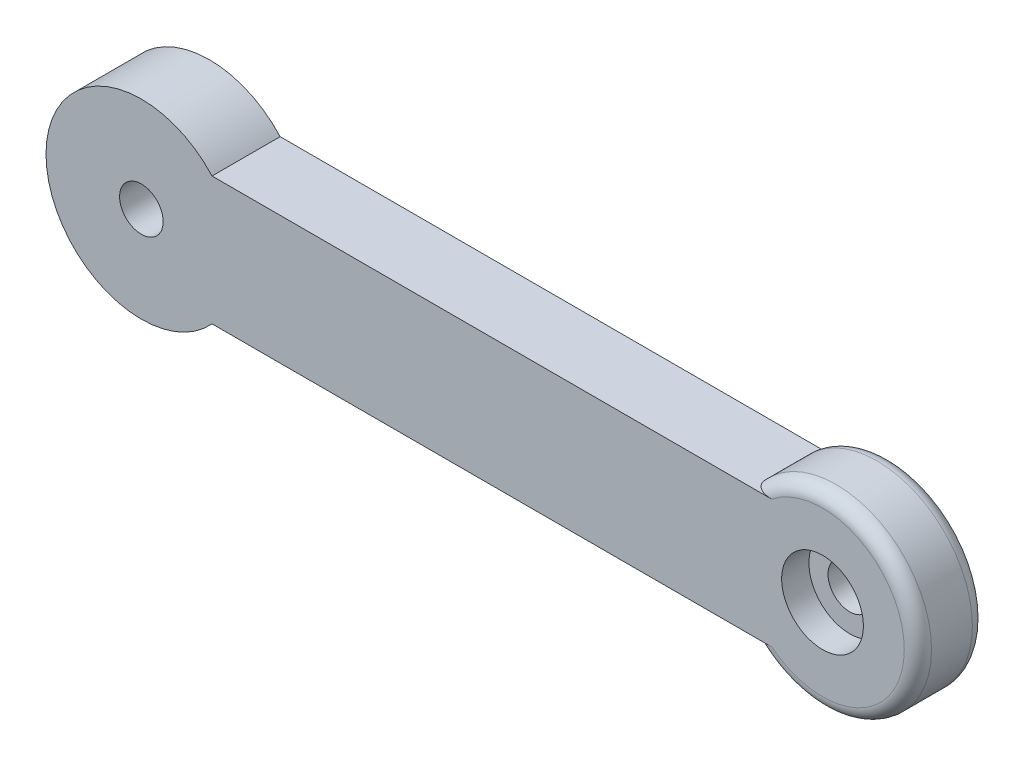
ISO-10303-21;
HEADER;
FILE_DESCRIPTION(('STEP AP214'),'2;1');
FILE_NAME('part.step','',(''),(''),'','','');
FILE_SCHEMA(('AUTOMOTIVE_DESIGN { 1 0 10303 214 1 1 1 1 }'));
ENDSEC;
DATA;
#1=APPLICATION_CONTEXT('core data for automotive mechanical design processes');
#2=APPLICATION_PROTOCOL_DEFINITION('international standard','automotive_design',2000,#1);
#3=PRODUCT_CONTEXT('',#1,'mechanical');
#4=PRODUCT('Part','Part','',(#3));
#5=PRODUCT_RELATED_PRODUCT_CATEGORY('part','',(#4));
#6=PRODUCT_DEFINITION_FORMATION('','',#4);
#7=PRODUCT_DEFINITION_CONTEXT('part definition',#1,'design');
#8=PRODUCT_DEFINITION('design','',#6,#7);
#9=PRODUCT_DEFINITION_SHAPE('','',#8);
#10=(LENGTH_UNIT() NAMED_UNIT(*) SI_UNIT(.MILLI.,.METRE.));
#11=(NAMED_UNIT(*) PLANE_ANGLE_UNIT() SI_UNIT($,.RADIAN.));
#12=(NAMED_UNIT(*) SI_UNIT($,.STERADIAN.) SOLID_ANGLE_UNIT());
#13=UNCERTAINTY_MEASURE_WITH_UNIT(LENGTH_MEASURE(1.E-05),#10,'distance_accuracy_value','');
#14=(GEOMETRIC_REPRESENTATION_CONTEXT(3) GLOBAL_UNCERTAINTY_ASSIGNED_CONTEXT((#13)) GLOBAL_UNIT_ASSIGNED_CONTEXT((#10,
#11,#12)) REPRESENTATION_CONTEXT('',''));
#15=CARTESIAN_POINT('',(0.,0.,0.));
#16=DIRECTION('',(0.,0.,1.));
#17=DIRECTION('',(1.,0.,0.));
#18=AXIS2_PLACEMENT_3D('',#15,#16,#17);
#19=CARTESIAN_POINT('',(50.,0.,5.));
#20=DIRECTION('',(0.,0.,-1.));
#21=DIRECTION('',(-1.,0.,0.));
#22=AXIS2_PLACEMENT_3D('',#19,#20,#21);
#23=CYLINDRICAL_SURFACE('',#22,1.6);
#24=CARTESIAN_POINT('',(50.,0.,0.));
#25=DIRECTION('',(0.,0.,1.));
#26=DIRECTION('',(1.,0.,0.));
#27=AXIS2_PLACEMENT_3D('',#24,#25,#26);
#28=CIRCLE('',#27,1.6);
#29=CARTESIAN_POINT('',(51.6,0.,0.));
#30=VERTEX_POINT('',#29);
#31=EDGE_CURVE('E136',#30,#30,#28,.T.);
#32=ORIENTED_EDGE('',*,*,#31,.F.);
#33=EDGE_LOOP('',(#32));
#34=FACE_BOUND('',#33,.T.);
#35=CARTESIAN_POINT('',(50.,0.,3.));
#36=DIRECTION('',(0.,0.,1.));
#37=DIRECTION('',(1.,0.,0.));
#38=AXIS2_PLACEMENT_3D('',#35,#36,#37);
#39=CIRCLE('',#38,1.6);
#40=CARTESIAN_POINT('',(51.6,0.,3.));
#41=VERTEX_POINT('',#40);
#42=EDGE_CURVE('E132',#41,#41,#39,.T.);
#43=ORIENTED_EDGE('',*,*,#42,.T.);
#44=EDGE_LOOP('',(#43));
#45=FACE_BOUND('',#44,.T.);
#46=ADVANCED_FACE('F37',(#34,#45),#23,.F.);
#47=CARTESIAN_POINT('',(0.,-4.7,5.));
#48=DIRECTION('',(0.,1.,0.));
#49=DIRECTION('',(0.,0.,1.));
#50=AXIS2_PLACEMENT_3D('',#47,#48,#49);
#51=PLANE('',#50);
#52=DIRECTION('',(1.,0.,0.));
#53=VECTOR('',#52,1.);
#54=CARTESIAN_POINT('',(0.,-4.7,5.));
#55=LINE('',#54,#53);
#56=CARTESIAN_POINT('',(5.18748493973718,-4.7,5.));
#57=VERTEX_POINT('',#56);
#58=CARTESIAN_POINT('',(46.2703887602057,-4.7,5.));
#59=VERTEX_POINT('',#58);
#60=EDGE_CURVE('E65',#57,#59,#55,.T.);
#61=ORIENTED_EDGE('',*,*,#60,.F.);
#62=DIRECTION('',(0.,0.,1.));
#63=VECTOR('',#62,1.);
#64=CARTESIAN_POINT('',(5.18748493973718,-4.7,0.));
#65=LINE('',#64,#63);
#66=CARTESIAN_POINT('',(5.18748493973718,-4.7,0.));
#67=VERTEX_POINT('',#66);
#68=EDGE_CURVE('E113',#57,#67,#65,.F.);
#69=ORIENTED_EDGE('',*,*,#68,.T.);
#70=DIRECTION('',(1.,0.,0.));
#71=VECTOR('',#70,1.);
#72=CARTESIAN_POINT('',(0.,-4.7,0.));
#73=LINE('',#72,#71);
#74=CARTESIAN_POINT('',(46.2703887602057,-4.7,0.));
#75=VERTEX_POINT('',#74);
#76=EDGE_CURVE('E104',#67,#75,#73,.T.);
#77=ORIENTED_EDGE('',*,*,#76,.T.);
#78=CARTESIAN_POINT('',(46.2703887602057,-4.7,0.));
#79=CARTESIAN_POINT('',(46.207775908054,-4.7,1.29160496456107E-05));
#80=CARTESIAN_POINT('',(46.145117563673,-4.7,0.00227437282465497));
#81=CARTESIAN_POINT('',(46.0199481893415,-4.7,0.0118273800545397));
#82=CARTESIAN_POINT('',(45.9574386747327,-4.7,0.0191384170084201));
#83=CARTESIAN_POINT('',(45.8324410994155,-4.7,0.0394710863082272));
#84=CARTESIAN_POINT('',(45.7699652687475,-4.7,0.0525702260540256));
#85=CARTESIAN_POINT('',(45.6467753973174,-4.7,0.0850983438826876));
#86=CARTESIAN_POINT('',(45.5860584334084,-4.7,0.104516075005994));
#87=CARTESIAN_POINT('',(45.4634272698965,-4.7,0.151848009624573));
#88=CARTESIAN_POINT('',(45.4016906517796,-4.7,0.180231436314618));
#89=CARTESIAN_POINT('',(45.2831858420289,-4.7,0.245628105858938));
#90=CARTESIAN_POINT('',(45.2263984340426,-4.7,0.282605720433216));
#91=CARTESIAN_POINT('',(45.1293399579975,-4.7,0.358446107781042));
#92=CARTESIAN_POINT('',(45.0879213757702,-4.7,0.395830324599347));
#93=CARTESIAN_POINT('',(45.0116713655026,-4.7,0.476880957830328));
#94=CARTESIAN_POINT('',(44.9768365048115,-4.7,0.520544079491267));
#95=CARTESIAN_POINT('',(44.9213213921304,-4.7,0.605177600143538));
#96=CARTESIAN_POINT('',(44.8992215804084,-4.7,0.645214921997107));
#97=CARTESIAN_POINT('',(44.8619994490983,-4.7,0.728383597377398));
#98=CARTESIAN_POINT('',(44.8468643031955,-4.7,0.771509092931161));
#99=CARTESIAN_POINT('',(44.8280442961094,-4.7,0.845694544044094));
#100=CARTESIAN_POINT('',(44.8222488202584,-4.7,0.876230734391645));
#101=CARTESIAN_POINT('',(44.8144721882695,-4.7,0.937835875568852));
#102=CARTESIAN_POINT('',(44.8124975383637,-4.7,0.968905644416676));
#103=CARTESIAN_POINT('',(44.8125150602628,-4.7,1.));
#104=B_SPLINE_CURVE_WITH_KNOTS('',3,(#78,#79,#80,#81,#82,#83,#84,#85,#86,#87,#88,#89,#90,#91,
#92,#93,#94,#95,#96,#97,#98,#99,#100,#101,#102,#103),.UNSPECIFIED.,.F.,.F.,(4,2,2,2,2,2,2,2,2,2,
2,2,4),(0.,0.187866694608945,0.37646245367986,0.567664035206988,0.758527126740674,
0.961764135364209,1.16417317210963,1.33093989148298,1.49761941994067,1.63425722653433,
1.7706423801825,1.86366074564951,1.95683736702942),.UNSPECIFIED.);
#105=CARTESIAN_POINT('',(44.8125150602628,-4.7,1.));
#106=VERTEX_POINT('',#105);
#107=EDGE_CURVE('E162',#75,#106,#104,.T.);
#108=ORIENTED_EDGE('',*,*,#107,.T.);
#109=DIRECTION('',(0.,0.,1.));
#110=VECTOR('',#109,1.);
#111=CARTESIAN_POINT('',(44.8125150602628,-4.7,0.));
#112=LINE('',#111,#110);
#113=CARTESIAN_POINT('',(44.8125150602628,-4.7,4.));
#114=VERTEX_POINT('',#113);
#115=EDGE_CURVE('E125',#106,#114,#112,.T.);
#116=ORIENTED_EDGE('',*,*,#115,.T.);
#117=CARTESIAN_POINT('',(44.8125150602628,-4.7,4.));
#118=CARTESIAN_POINT('',(44.8125120610079,-4.7,4.02280387526401));
#119=CARTESIAN_POINT('',(44.8135685108652,-4.7,4.04559463575991));
#120=CARTESIAN_POINT('',(44.8177614844832,-4.7,4.09097120432428));
#121=CARTESIAN_POINT('',(44.8208968190355,-4.7,4.11355712208801));
#122=CARTESIAN_POINT('',(44.8333000949138,-4.7,4.1804300519192));
#123=CARTESIAN_POINT('',(44.8455666981841,-4.7,4.22419230356238));
#124=CARTESIAN_POINT('',(44.8772973600379,-4.7,4.30886791390421));
#125=CARTESIAN_POINT('',(44.8967477203535,-4.7,4.34978651967407));
#126=CARTESIAN_POINT('',(44.94180379897,-4.7,4.42813589515815));
#127=CARTESIAN_POINT('',(44.9674204981199,-4.7,4.46556027556062));
#128=CARTESIAN_POINT('',(45.033076516768,-4.7,4.54823376493902));
#129=CARTESIAN_POINT('',(45.0750758718973,-4.7,4.59192510929579));
#130=CARTESIAN_POINT('',(45.1655744452973,-4.7,4.67188847077413));
#131=CARTESIAN_POINT('',(45.2140816465881,-4.7,4.70815123514663));
#132=CARTESIAN_POINT('',(45.33483354808,-4.7,4.78585081140482));
#133=CARTESIAN_POINT('',(45.4091325805437,-4.7,4.82408351520603));
#134=CARTESIAN_POINT('',(45.5629594909616,-4.7,4.88839757582565));
#135=CARTESIAN_POINT('',(45.6425066714387,-4.7,4.91443085344081));
#136=CARTESIAN_POINT('',(45.8131252520922,-4.7,4.95795584739086));
#137=CARTESIAN_POINT('',(45.9045083700955,-4.7,4.97420889132121));
#138=CARTESIAN_POINT('',(46.0419452211501,-4.7,4.98995660732144));
#139=CARTESIAN_POINT('',(46.0875733038723,-4.7,4.9937694112039));
#140=CARTESIAN_POINT('',(46.1789282433256,-4.7,4.99878744537383));
#141=CARTESIAN_POINT('',(46.2246549534658,-4.7,4.99999530928638));
#142=CARTESIAN_POINT('',(46.2703887602057,-4.7,5.));
#143=B_SPLINE_CURVE_WITH_KNOTS('',3,(#117,#118,#119,#120,#121,#122,#123,#124,#125,#126,#127,
#128,#129,#130,#131,#132,#133,#134,#135,#136,#137,#138,#139,#140,#141,#142),.UNSPECIFIED.,.F.,
.F.,(4,2,2,2,2,2,2,2,2,2,2,2,4),(0.,0.0683620421144346,0.136685011997662,0.272266866080453,
0.40759151105005,0.54315894481295,0.723976759395929,0.905018442255688,1.15431883004411,
1.40459364056728,1.6821191913487,1.81942340828655,1.95658874383677),.UNSPECIFIED.);
#144=EDGE_CURVE('E11',#114,#59,#143,.T.);
#145=ORIENTED_EDGE('',*,*,#144,.T.);
#146=EDGE_LOOP('',(#61,#69,#77,#108,#116,#145));
#147=FACE_BOUND('',#146,.T.);
#148=ADVANCED_FACE('F172',(#147),#51,.F.);
#149=CARTESIAN_POINT('',(0.,4.7,5.));
#150=DIRECTION('',(0.,1.,0.));
#151=DIRECTION('',(0.,0.,1.));
#152=AXIS2_PLACEMENT_3D('',#149,#150,#151);
#153=PLANE('',#152);
#154=DIRECTION('',(0.,0.,1.));
#155=VECTOR('',#154,1.);
#156=CARTESIAN_POINT('',(5.18748493973718,4.7,0.));
#157=LINE('',#156,#155);
#158=CARTESIAN_POINT('',(5.18748493973718,4.7,5.));
#159=VERTEX_POINT('',#158);
#160=CARTESIAN_POINT('',(5.18748493973718,4.7,0.));
#161=VERTEX_POINT('',#160);
#162=EDGE_CURVE('E96',#159,#161,#157,.F.);
#163=ORIENTED_EDGE('',*,*,#162,.F.);
#164=DIRECTION('',(1.,0.,0.));
#165=VECTOR('',#164,1.);
#166=CARTESIAN_POINT('',(0.,4.7,5.));
#167=LINE('',#166,#165);
#168=CARTESIAN_POINT('',(46.2703887602057,4.7,5.));
#169=VERTEX_POINT('',#168);
#170=EDGE_CURVE('E57',#159,#169,#167,.T.);
#171=ORIENTED_EDGE('',*,*,#170,.T.);
#172=CARTESIAN_POINT('',(46.2703887602057,4.7,5.));
#173=CARTESIAN_POINT('',(46.207775908054,4.7,4.99998708395035));
#174=CARTESIAN_POINT('',(46.145117563673,4.7,4.99772562717535));
#175=CARTESIAN_POINT('',(46.0199481893415,4.7,4.98817261994546));
#176=CARTESIAN_POINT('',(45.9574386747327,4.7,4.98086158299158));
#177=CARTESIAN_POINT('',(45.8324410994155,4.7,4.96052891369177));
#178=CARTESIAN_POINT('',(45.7699652687475,4.7,4.94742977394598));
#179=CARTESIAN_POINT('',(45.6467753973174,4.7,4.91490165611732));
#180=CARTESIAN_POINT('',(45.5860584334084,4.7,4.89548392499401));
#181=CARTESIAN_POINT('',(45.4634272698965,4.7,4.84815199037543));
#182=CARTESIAN_POINT('',(45.4016906517796,4.7,4.81976856368538));
#183=CARTESIAN_POINT('',(45.2831858420289,4.7,4.75437189414106));
#184=CARTESIAN_POINT('',(45.2263984340426,4.7,4.71739427956678));
#185=CARTESIAN_POINT('',(45.1293399579975,4.7,4.64155389221896));
#186=CARTESIAN_POINT('',(45.0879213757702,4.7,4.60416967540065));
#187=CARTESIAN_POINT('',(45.0116713655026,4.7,4.52311904216967));
#188=CARTESIAN_POINT('',(44.9768365048115,4.7,4.47945592050873));
#189=CARTESIAN_POINT('',(44.9213213921304,4.7,4.39482239985646));
#190=CARTESIAN_POINT('',(44.8992215804084,4.7,4.35478507800289));
#191=CARTESIAN_POINT('',(44.8619994490983,4.7,4.2716164026226));
#192=CARTESIAN_POINT('',(44.8468643031955,4.7,4.22849090706884));
#193=CARTESIAN_POINT('',(44.8280442961094,4.7,4.1543054559559));
#194=CARTESIAN_POINT('',(44.8222488202584,4.7,4.12376926560835));
#195=CARTESIAN_POINT('',(44.8144721882695,4.7,4.06216412443115));
#196=CARTESIAN_POINT('',(44.8124975383637,4.7,4.03109435558332));
#197=CARTESIAN_POINT('',(44.8125150602628,4.7,4.));
#198=B_SPLINE_CURVE_WITH_KNOTS('',3,(#172,#173,#174,#175,#176,#177,#178,#179,#180,#181,#182,
#183,#184,#185,#186,#187,#188,#189,#190,#191,#192,#193,#194,#195,#196,#197),.UNSPECIFIED.,.F.,
.F.,(4,2,2,2,2,2,2,2,2,2,2,2,4),(0.,0.187866694608931,0.376462453679853,0.567664035206974,
0.758527126740674,0.961764135364209,1.16417317210963,1.33093989148298,1.49761941994067,
1.63425722653433,1.7706423801825,1.86366074564952,1.95683736702942),.UNSPECIFIED.);
#199=CARTESIAN_POINT('',(44.8125150602628,4.7,4.));
#200=VERTEX_POINT('',#199);
#201=EDGE_CURVE('E50',#169,#200,#198,.T.);
#202=ORIENTED_EDGE('',*,*,#201,.T.);
#203=DIRECTION('',(0.,0.,1.));
#204=VECTOR('',#203,1.);
#205=CARTESIAN_POINT('',(44.8125150602628,4.7,0.));
#206=LINE('',#205,#204);
#207=CARTESIAN_POINT('',(44.8125150602628,4.7,1.));
#208=VERTEX_POINT('',#207);
#209=EDGE_CURVE('E122',#208,#200,#206,.T.);
#210=ORIENTED_EDGE('',*,*,#209,.F.);
#211=CARTESIAN_POINT('',(44.8125150602628,4.7,1.));
#212=CARTESIAN_POINT('',(44.8125120610079,4.7,0.977196124735995));
#213=CARTESIAN_POINT('',(44.8135685108652,4.7,0.954405364240088));
#214=CARTESIAN_POINT('',(44.8177614844832,4.7,0.909028795675719));
#215=CARTESIAN_POINT('',(44.8208968190355,4.7,0.886442877911987));
#216=CARTESIAN_POINT('',(44.8333000949138,4.7,0.819569948080799));
#217=CARTESIAN_POINT('',(44.8455666981841,4.7,0.775807696437622));
#218=CARTESIAN_POINT('',(44.8772973600379,4.7,0.691132086095793));
#219=CARTESIAN_POINT('',(44.8967477203535,4.7,0.650213480325933));
#220=CARTESIAN_POINT('',(44.94180379897,4.7,0.571864104841849));
#221=CARTESIAN_POINT('',(44.9674204981199,4.7,0.534439724439377));
#222=CARTESIAN_POINT('',(45.033076516768,4.7,0.451766235060978));
#223=CARTESIAN_POINT('',(45.0750758718973,4.7,0.408074890704212));
#224=CARTESIAN_POINT('',(45.1655744452973,4.7,0.328111529225869));
#225=CARTESIAN_POINT('',(45.2140816465881,4.7,0.291848764853375));
#226=CARTESIAN_POINT('',(45.33483354808,4.7,0.214149188595176));
#227=CARTESIAN_POINT('',(45.4091325805437,4.7,0.175916484793966));
#228=CARTESIAN_POINT('',(45.5629594909616,4.7,0.111602424174352));
#229=CARTESIAN_POINT('',(45.6425066714387,4.7,0.0855691465591886));
#230=CARTESIAN_POINT('',(45.8131252520922,4.7,0.0420441526091433));
#231=CARTESIAN_POINT('',(45.9045083700955,4.7,0.0257911086787907));
#232=CARTESIAN_POINT('',(46.0419452211501,4.7,0.0100433926785639));
#233=CARTESIAN_POINT('',(46.0875733038723,4.7,0.00623058879610467));
#234=CARTESIAN_POINT('',(46.1789282433256,4.7,0.00121255462617282));
#235=CARTESIAN_POINT('',(46.2246549534658,4.7,4.69071362091923E-06));
#236=CARTESIAN_POINT('',(46.2703887602057,4.7,0.));
#237=B_SPLINE_CURVE_WITH_KNOTS('',3,(#211,#212,#213,#214,#215,#216,#217,#218,#219,#220,#221,
#222,#223,#224,#225,#226,#227,#228,#229,#230,#231,#232,#233,#234,#235,#236),.UNSPECIFIED.,.F.,
.F.,(4,2,2,2,2,2,2,2,2,2,2,2,4),(0.,0.0683620421144353,0.136685011997662,0.272266866080453,
0.407591511050045,0.543158944812951,0.723976759395928,0.905018442255688,1.15431883004411,
1.40459364056728,1.6821191913487,1.81942340828655,1.95658874383677),.UNSPECIFIED.);
#238=CARTESIAN_POINT('',(46.2703887602057,4.7,0.));
#239=VERTEX_POINT('',#238);
#240=EDGE_CURVE('E98',#208,#239,#237,.T.);
#241=ORIENTED_EDGE('',*,*,#240,.T.);
#242=DIRECTION('',(1.,0.,0.));
#243=VECTOR('',#242,1.);
#244=CARTESIAN_POINT('',(0.,4.7,0.));
#245=LINE('',#244,#243);
#246=EDGE_CURVE('E93',#161,#239,#245,.T.);
#247=ORIENTED_EDGE('',*,*,#246,.F.);
#248=EDGE_LOOP('',(#163,#171,#202,#210,#241,#247));
#249=FACE_BOUND('',#248,.T.);
#250=ADVANCED_FACE('F95',(#249),#153,.T.);
#251=CARTESIAN_POINT('',(0.,0.,5.));
#252=DIRECTION('',(0.,0.,-1.));
#253=DIRECTION('',(-1.,0.,0.));
#254=AXIS2_PLACEMENT_3D('',#251,#252,#253);
#255=CYLINDRICAL_SURFACE('',#254,1.6);
#256=CARTESIAN_POINT('',(0.,0.,5.));
#257=DIRECTION('',(0.,0.,1.));
#258=DIRECTION('',(1.,0.,0.));
#259=AXIS2_PLACEMENT_3D('',#256,#257,#258);
#260=CIRCLE('',#259,1.6);
#261=CARTESIAN_POINT('',(1.6,0.,5.));
#262=VERTEX_POINT('',#261);
#263=EDGE_CURVE('E138',#262,#262,#260,.T.);
#264=ORIENTED_EDGE('',*,*,#263,.T.);
#265=EDGE_LOOP('',(#264));
#266=FACE_BOUND('',#265,.T.);
#267=CARTESIAN_POINT('',(0.,0.,0.));
#268=DIRECTION('',(0.,0.,1.));
#269=DIRECTION('',(1.,0.,0.));
#270=AXIS2_PLACEMENT_3D('',#267,#268,#269);
#271=CIRCLE('',#270,1.6);
#272=CARTESIAN_POINT('',(1.6,0.,0.));
#273=VERTEX_POINT('',#272);
#274=EDGE_CURVE('E103',#273,#273,#271,.T.);
#275=ORIENTED_EDGE('',*,*,#274,.F.);
#276=EDGE_LOOP('',(#275));
#277=FACE_BOUND('',#276,.T.);
#278=ADVANCED_FACE('F171',(#266,#277),#255,.F.);
#279=CARTESIAN_POINT('',(0.,0.,5.));
#280=DIRECTION('',(0.,0.,1.));
#281=DIRECTION('',(1.,0.,0.));
#282=AXIS2_PLACEMENT_3D('',#279,#280,#281);
#283=PLANE('',#282);
#284=CARTESIAN_POINT('',(50.,0.,5.));
#285=DIRECTION('',(0.,0.,1.));
#286=DIRECTION('',(1.,0.,0.));
#287=AXIS2_PLACEMENT_3D('',#284,#285,#286);
#288=CIRCLE('',#287,6.);
#289=EDGE_CURVE('E155',#59,#169,#288,.T.);
#290=ORIENTED_EDGE('',*,*,#289,.T.);
#291=ORIENTED_EDGE('',*,*,#170,.F.);
#292=CARTESIAN_POINT('',(0.,0.,5.));
#293=DIRECTION('',(0.,0.,1.));
#294=DIRECTION('',(1.,0.,0.));
#295=AXIS2_PLACEMENT_3D('',#292,#293,#294);
#296=CIRCLE('',#295,7.);
#297=EDGE_CURVE('E112',#159,#57,#296,.T.);
#298=ORIENTED_EDGE('',*,*,#297,.T.);
#299=ORIENTED_EDGE('',*,*,#60,.T.);
#300=EDGE_LOOP('',(#290,#291,#298,#299));
#301=FACE_BOUND('',#300,.T.);
#302=CARTESIAN_POINT('',(50.,0.,5.));
#303=DIRECTION('',(0.,0.,1.));
#304=DIRECTION('',(1.,0.,0.));
#305=AXIS2_PLACEMENT_3D('',#302,#303,#304);
#306=CIRCLE('',#305,3.);
#307=CARTESIAN_POINT('',(53.,0.,5.));
#308=VERTEX_POINT('',#307);
#309=EDGE_CURVE('E128',#308,#308,#306,.T.);
#310=ORIENTED_EDGE('',*,*,#309,.F.);
#311=EDGE_LOOP('',(#310));
#312=FACE_BOUND('',#311,.T.);
#313=ORIENTED_EDGE('',*,*,#263,.F.);
#314=EDGE_LOOP('',(#313));
#315=FACE_BOUND('',#314,.T.);
#316=ADVANCED_FACE('F206',(#301,#312,#315),#283,.T.);
#317=CARTESIAN_POINT('',(0.,0.,0.));
#318=DIRECTION('',(0.,0.,1.));
#319=DIRECTION('',(1.,0.,0.));
#320=AXIS2_PLACEMENT_3D('',#317,#318,#319);
#321=PLANE('',#320);
#322=ORIENTED_EDGE('',*,*,#246,.T.);
#323=CARTESIAN_POINT('',(50.,0.,0.));
#324=DIRECTION('',(0.,0.,1.));
#325=DIRECTION('',(1.,0.,0.));
#326=AXIS2_PLACEMENT_3D('',#323,#324,#325);
#327=CIRCLE('',#326,6.);
#328=EDGE_CURVE('E153',#239,#75,#327,.F.);
#329=ORIENTED_EDGE('',*,*,#328,.T.);
#330=ORIENTED_EDGE('',*,*,#76,.F.);
#331=CARTESIAN_POINT('',(0.,0.,0.));
#332=DIRECTION('',(0.,0.,1.));
#333=DIRECTION('',(1.,0.,0.));
#334=AXIS2_PLACEMENT_3D('',#331,#332,#333);
#335=CIRCLE('',#334,7.);
#336=EDGE_CURVE('E111',#161,#67,#335,.T.);
#337=ORIENTED_EDGE('',*,*,#336,.F.);
#338=EDGE_LOOP('',(#322,#329,#330,#337));
#339=FACE_BOUND('',#338,.T.);
#340=ORIENTED_EDGE('',*,*,#31,.T.);
#341=EDGE_LOOP('',(#340));
#342=FACE_BOUND('',#341,.T.);
#343=ORIENTED_EDGE('',*,*,#274,.T.);
#344=EDGE_LOOP('',(#343));
#345=FACE_BOUND('',#344,.T.);
#346=ADVANCED_FACE('F116',(#339,#342,#345),#321,.F.);
#347=CARTESIAN_POINT('',(50.,0.,3.));
#348=DIRECTION('',(0.,0.,1.));
#349=DIRECTION('',(1.,0.,0.));
#350=AXIS2_PLACEMENT_3D('',#347,#348,#349);
#351=CYLINDRICAL_SURFACE('',#350,3.);
#352=CARTESIAN_POINT('',(50.,0.,3.));
#353=DIRECTION('',(0.,0.,1.));
#354=DIRECTION('',(1.,0.,0.));
#355=AXIS2_PLACEMENT_3D('',#352,#353,#354);
#356=CIRCLE('',#355,3.);
#357=CARTESIAN_POINT('',(53.,0.,3.));
#358=VERTEX_POINT('',#357);
#359=EDGE_CURVE('E129',#358,#358,#356,.T.);
#360=ORIENTED_EDGE('',*,*,#359,.F.);
#361=EDGE_LOOP('',(#360));
#362=FACE_BOUND('',#361,.T.);
#363=ORIENTED_EDGE('',*,*,#309,.T.);
#364=EDGE_LOOP('',(#363));
#365=FACE_BOUND('',#364,.T.);
#366=ADVANCED_FACE('F205',(#362,#365),#351,.F.);
#367=CARTESIAN_POINT('',(50.,0.,3.));
#368=DIRECTION('',(0.,0.,1.));
#369=DIRECTION('',(1.,0.,0.));
#370=AXIS2_PLACEMENT_3D('',#367,#368,#369);
#371=PLANE('',#370);
#372=ORIENTED_EDGE('',*,*,#42,.F.);
#373=EDGE_LOOP('',(#372));
#374=FACE_BOUND('',#373,.T.);
#375=ORIENTED_EDGE('',*,*,#359,.T.);
#376=EDGE_LOOP('',(#375));
#377=FACE_BOUND('',#376,.T.);
#378=ADVANCED_FACE('F211',(#374,#377),#371,.T.);
#379=CARTESIAN_POINT('',(50.,0.,0.));
#380=DIRECTION('',(0.,0.,1.));
#381=DIRECTION('',(1.,0.,0.));
#382=AXIS2_PLACEMENT_3D('',#379,#380,#381);
#383=CYLINDRICAL_SURFACE('',#382,7.);
#384=ORIENTED_EDGE('',*,*,#115,.F.);
#385=CARTESIAN_POINT('',(50.,0.,1.));
#386=DIRECTION('',(0.,0.,1.));
#387=DIRECTION('',(1.,0.,0.));
#388=AXIS2_PLACEMENT_3D('',#385,#386,#387);
#389=CIRCLE('',#388,7.);
#390=EDGE_CURVE('E150',#106,#208,#389,.T.);
#391=ORIENTED_EDGE('',*,*,#390,.T.);
#392=ORIENTED_EDGE('',*,*,#209,.T.);
#393=CARTESIAN_POINT('',(50.,0.,4.));
#394=DIRECTION('',(0.,0.,1.));
#395=DIRECTION('',(1.,0.,0.));
#396=AXIS2_PLACEMENT_3D('',#393,#394,#395);
#397=CIRCLE('',#396,7.);
#398=EDGE_CURVE('E141',#200,#114,#397,.F.);
#399=ORIENTED_EDGE('',*,*,#398,.T.);
#400=EDGE_LOOP('',(#384,#391,#392,#399));
#401=FACE_BOUND('',#400,.T.);
#402=ADVANCED_FACE('F186',(#401),#383,.T.);
#403=CARTESIAN_POINT('',(0.,0.,0.));
#404=DIRECTION('',(0.,0.,1.));
#405=DIRECTION('',(1.,0.,0.));
#406=AXIS2_PLACEMENT_3D('',#403,#404,#405);
#407=CYLINDRICAL_SURFACE('',#406,7.);
#408=ORIENTED_EDGE('',*,*,#68,.F.);
#409=ORIENTED_EDGE('',*,*,#297,.F.);
#410=ORIENTED_EDGE('',*,*,#162,.T.);
#411=ORIENTED_EDGE('',*,*,#336,.T.);
#412=EDGE_LOOP('',(#408,#409,#410,#411));
#413=FACE_BOUND('',#412,.T.);
#414=ADVANCED_FACE('F110',(#413),#407,.T.);
#415=CARTESIAN_POINT('',(50.,0.,1.));
#416=DIRECTION('',(0.,0.,1.));
#417=DIRECTION('',(1.,0.,0.));
#418=AXIS2_PLACEMENT_3D('',#415,#416,#417);
#419=TOROIDAL_SURFACE('',#418,6.,1.);
#420=ORIENTED_EDGE('',*,*,#107,.F.);
#421=ORIENTED_EDGE('',*,*,#328,.F.);
#422=ORIENTED_EDGE('',*,*,#240,.F.);
#423=ORIENTED_EDGE('',*,*,#390,.F.);
#424=EDGE_LOOP('',(#420,#421,#422,#423));
#425=FACE_BOUND('',#424,.T.);
#426=ADVANCED_FACE('F166',(#425),#419,.T.);
#427=CARTESIAN_POINT('',(50.,0.,4.));
#428=DIRECTION('',(0.,0.,1.));
#429=DIRECTION('',(1.,0.,0.));
#430=AXIS2_PLACEMENT_3D('',#427,#428,#429);
#431=TOROIDAL_SURFACE('',#430,6.,1.);
#432=ORIENTED_EDGE('',*,*,#144,.F.);
#433=ORIENTED_EDGE('',*,*,#398,.F.);
#434=ORIENTED_EDGE('',*,*,#201,.F.);
#435=ORIENTED_EDGE('',*,*,#289,.F.);
#436=EDGE_LOOP('',(#432,#433,#434,#435));
#437=FACE_BOUND('',#436,.T.);
#438=ADVANCED_FACE('F39',(#437),#431,.T.);
#439=CLOSED_SHELL('',(#46,#148,#250,#278,#316,#346,#366,#378,#402,#414,#426,#438));
#440=MANIFOLD_SOLID_BREP('B2',#439);
#441=ADVANCED_BREP_SHAPE_REPRESENTATION('',(#18,#440),#14);
#442=SHAPE_DEFINITION_REPRESENTATION(#9,#441);
ENDSEC;
END-ISO-10303-21;
